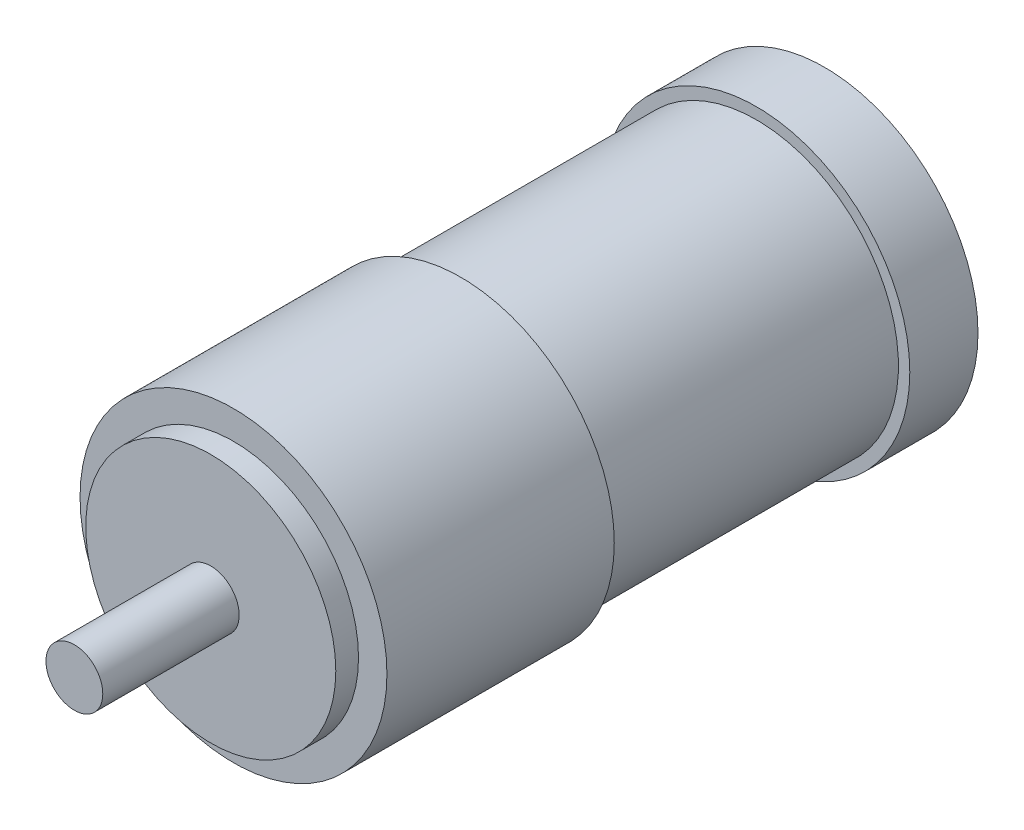
ISO-10303-21;
HEADER;
FILE_DESCRIPTION(('STEP AP214'),'2;1');
FILE_NAME('part.step','',(''),(''),'','','');
FILE_SCHEMA(('AUTOMOTIVE_DESIGN { 1 0 10303 214 1 1 1 1 }'));
ENDSEC;
DATA;
#1=APPLICATION_CONTEXT('core data for automotive mechanical design processes');
#2=APPLICATION_PROTOCOL_DEFINITION('international standard','automotive_design',2000,#1);
#3=PRODUCT_CONTEXT('',#1,'mechanical');
#4=PRODUCT('Part','Part','',(#3));
#5=PRODUCT_RELATED_PRODUCT_CATEGORY('part','',(#4));
#6=PRODUCT_DEFINITION_FORMATION('','',#4);
#7=PRODUCT_DEFINITION_CONTEXT('part definition',#1,'design');
#8=PRODUCT_DEFINITION('design','',#6,#7);
#9=PRODUCT_DEFINITION_SHAPE('','',#8);
#10=(LENGTH_UNIT() NAMED_UNIT(*) SI_UNIT(.MILLI.,.METRE.));
#11=(NAMED_UNIT(*) PLANE_ANGLE_UNIT() SI_UNIT($,.RADIAN.));
#12=(NAMED_UNIT(*) SI_UNIT($,.STERADIAN.) SOLID_ANGLE_UNIT());
#13=UNCERTAINTY_MEASURE_WITH_UNIT(LENGTH_MEASURE(1.E-05),#10,'distance_accuracy_value','');
#14=(GEOMETRIC_REPRESENTATION_CONTEXT(3) GLOBAL_UNCERTAINTY_ASSIGNED_CONTEXT((#13)) GLOBAL_UNIT_ASSIGNED_CONTEXT((#10,
#11,#12)) REPRESENTATION_CONTEXT('',''));
#15=CARTESIAN_POINT('',(0.,0.,0.));
#16=DIRECTION('',(0.,0.,1.));
#17=DIRECTION('',(1.,0.,0.));
#18=AXIS2_PLACEMENT_3D('',#15,#16,#17);
#19=CARTESIAN_POINT('',(0.,0.,52.));
#20=DIRECTION('',(0.,0.,-1.));
#21=DIRECTION('',(-1.,0.,0.));
#22=AXIS2_PLACEMENT_3D('',#19,#20,#21);
#23=CYLINDRICAL_SURFACE('',#22,12.5);
#24=CARTESIAN_POINT('',(0.,0.,32.));
#25=DIRECTION('',(0.,0.,1.));
#26=DIRECTION('',(1.,0.,0.));
#27=AXIS2_PLACEMENT_3D('',#24,#25,#26);
#28=CIRCLE('',#27,12.5);
#29=CARTESIAN_POINT('',(-12.5,0.,32.));
#30=VERTEX_POINT('',#29);
#31=EDGE_CURVE('E81',#30,#30,#28,.T.);
#32=CARTESIAN_POINT('',(0.,0.,6.));
#33=DIRECTION('',(0.,0.,-1.));
#34=DIRECTION('',(-1.,0.,0.));
#35=AXIS2_PLACEMENT_3D('',#32,#33,#34);
#36=CIRCLE('',#35,12.5);
#37=CARTESIAN_POINT('',(-12.5,0.,6.00000000000001));
#38=VERTEX_POINT('',#37);
#39=EDGE_CURVE('E65',#38,#38,#36,.T.);
#40=CARTESIAN_POINT('',(-12.5,0.,32.));
#41=CARTESIAN_POINT('',(-12.5,0.,31.7291666666667));
#42=CARTESIAN_POINT('',(-12.5,0.,31.4583333333333));
#43=CARTESIAN_POINT('',(-12.5,0.,30.9166666666667));
#44=CARTESIAN_POINT('',(-12.5,0.,30.6458333333333));
#45=CARTESIAN_POINT('',(-12.5,0.,30.1041666666667));
#46=CARTESIAN_POINT('',(-12.5,0.,29.8333333333333));
#47=CARTESIAN_POINT('',(-12.5,0.,29.2916666666667));
#48=CARTESIAN_POINT('',(-12.5,0.,29.0208333333333));
#49=CARTESIAN_POINT('',(-12.5,0.,28.4791666666667));
#50=CARTESIAN_POINT('',(-12.5,0.,28.2083333333333));
#51=CARTESIAN_POINT('',(-12.5,0.,27.6666666666667));
#52=CARTESIAN_POINT('',(-12.5,0.,27.3958333333333));
#53=CARTESIAN_POINT('',(-12.5,0.,26.8541666666667));
#54=CARTESIAN_POINT('',(-12.5,0.,26.5833333333333));
#55=CARTESIAN_POINT('',(-12.5,0.,26.0416666666667));
#56=CARTESIAN_POINT('',(-12.5,0.,25.7708333333333));
#57=CARTESIAN_POINT('',(-12.5,0.,25.2291666666667));
#58=CARTESIAN_POINT('',(-12.5,0.,24.9583333333333));
#59=CARTESIAN_POINT('',(-12.5,0.,24.4166666666667));
#60=CARTESIAN_POINT('',(-12.5,0.,24.1458333333333));
#61=CARTESIAN_POINT('',(-12.5,0.,23.6041666666667));
#62=CARTESIAN_POINT('',(-12.5,0.,23.3333333333333));
#63=CARTESIAN_POINT('',(-12.5,0.,22.7916666666667));
#64=CARTESIAN_POINT('',(-12.5,0.,22.5208333333333));
#65=CARTESIAN_POINT('',(-12.5,0.,21.9791666666667));
#66=CARTESIAN_POINT('',(-12.5,0.,21.7083333333333));
#67=CARTESIAN_POINT('',(-12.5,0.,21.1666666666667));
#68=CARTESIAN_POINT('',(-12.5,0.,20.8958333333333));
#69=CARTESIAN_POINT('',(-12.5,0.,20.3541666666667));
#70=CARTESIAN_POINT('',(-12.5,0.,20.0833333333333));
#71=CARTESIAN_POINT('',(-12.5,0.,19.5416666666667));
#72=CARTESIAN_POINT('',(-12.5,0.,19.2708333333333));
#73=CARTESIAN_POINT('',(-12.5,0.,18.7291666666667));
#74=CARTESIAN_POINT('',(-12.5,0.,18.4583333333333));
#75=CARTESIAN_POINT('',(-12.5,0.,17.9166666666667));
#76=CARTESIAN_POINT('',(-12.5,0.,17.6458333333333));
#77=CARTESIAN_POINT('',(-12.5,0.,17.1041666666667));
#78=CARTESIAN_POINT('',(-12.5,0.,16.8333333333333));
#79=CARTESIAN_POINT('',(-12.5,0.,16.2916666666667));
#80=CARTESIAN_POINT('',(-12.5,0.,16.0208333333333));
#81=CARTESIAN_POINT('',(-12.5,0.,15.4791666666667));
#82=CARTESIAN_POINT('',(-12.5,0.,15.2083333333333));
#83=CARTESIAN_POINT('',(-12.5,0.,14.6666666666667));
#84=CARTESIAN_POINT('',(-12.5,0.,14.3958333333333));
#85=CARTESIAN_POINT('',(-12.5,0.,13.8541666666667));
#86=CARTESIAN_POINT('',(-12.5,0.,13.5833333333333));
#87=CARTESIAN_POINT('',(-12.5,0.,13.0416666666667));
#88=CARTESIAN_POINT('',(-12.5,0.,12.7708333333333));
#89=CARTESIAN_POINT('',(-12.5,0.,12.2291666666667));
#90=CARTESIAN_POINT('',(-12.5,0.,11.9583333333333));
#91=CARTESIAN_POINT('',(-12.5,0.,11.4166666666667));
#92=CARTESIAN_POINT('',(-12.5,0.,11.1458333333333));
#93=CARTESIAN_POINT('',(-12.5,0.,10.6041666666667));
#94=CARTESIAN_POINT('',(-12.5,0.,10.3333333333333));
#95=CARTESIAN_POINT('',(-12.5,0.,9.79166666666667));
#96=CARTESIAN_POINT('',(-12.5,0.,9.52083333333334));
#97=CARTESIAN_POINT('',(-12.5,0.,8.97916666666667));
#98=CARTESIAN_POINT('',(-12.5,0.,8.70833333333334));
#99=CARTESIAN_POINT('',(-12.5,0.,8.16666666666667));
#100=CARTESIAN_POINT('',(-12.5,0.,7.89583333333334));
#101=CARTESIAN_POINT('',(-12.5,0.,7.35416666666667));
#102=CARTESIAN_POINT('',(-12.5,0.,7.08333333333334));
#103=CARTESIAN_POINT('',(-12.5,0.,6.54166666666667));
#104=CARTESIAN_POINT('',(-12.5,0.,6.27083333333334));
#105=CARTESIAN_POINT('',(-12.5,0.,6.00000000000001));
#106=B_SPLINE_CURVE_WITH_KNOTS('',3,(#40,#41,#42,#43,#44,#45,#46,#47,#48,#49,#50,#51,#52,#53,
#54,#55,#56,#57,#58,#59,#60,#61,#62,#63,#64,#65,#66,#67,#68,#69,#70,#71,#72,#73,#74,#75,#76,#77,
#78,#79,#80,#81,#82,#83,#84,#85,#86,#87,#88,#89,#90,#91,#92,#93,#94,#95,#96,#97,#98,#99,#100,
#101,#102,#103,#104,#105),.UNSPECIFIED.,.F.,.F.,(4,2,2,2,2,2,2,2,2,2,2,2,2,2,2,2,2,2,2,2,2,2,2,
2,2,2,2,2,2,2,2,2,4),(0.,0.812500000000004,1.625,2.4375,3.25,4.0625,4.875,5.6875,6.5,7.3125,
8.125,8.9375,9.75,10.5625,11.375,12.1875,13.,13.8125,14.625,15.4375,16.25,17.0625,17.875,
18.6875,19.5,20.3125,21.125,21.9375,22.75,23.5625,24.375,25.1875,26.),.UNSPECIFIED.);
#107=EDGE_CURVE('BSEAM47',#30,#38,#106,.T.);
#108=ORIENTED_EDGE('',*,*,#31,.F.);
#109=ORIENTED_EDGE('',*,*,#39,.F.);
#110=ORIENTED_EDGE('',*,*,#107,.T.);
#111=ORIENTED_EDGE('',*,*,#107,.F.);
#112=EDGE_LOOP('',(#108,#110,#109,#111));
#113=FACE_BOUND('',#112,.T.);
#114=ADVANCED_FACE('F47',(#113),#23,.T.);
#115=CARTESIAN_POINT('',(0.,0.,52.));
#116=DIRECTION('',(0.,0.,1.));
#117=DIRECTION('',(1.,0.,0.));
#118=AXIS2_PLACEMENT_3D('',#115,#116,#117);
#119=PLANE('',#118);
#120=CARTESIAN_POINT('',(0.,0.,52.));
#121=DIRECTION('',(0.,0.,1.));
#122=DIRECTION('',(1.,0.,0.));
#123=AXIS2_PLACEMENT_3D('',#120,#121,#122);
#124=CIRCLE('',#123,11.);
#125=CARTESIAN_POINT('',(11.,0.,52.));
#126=VERTEX_POINT('',#125);
#127=EDGE_CURVE('E77',#126,#126,#124,.T.);
#128=ORIENTED_EDGE('',*,*,#127,.F.);
#129=EDGE_LOOP('',(#128));
#130=FACE_BOUND('',#129,.T.);
#131=CARTESIAN_POINT('',(0.,0.,52.));
#132=DIRECTION('',(0.,0.,1.));
#133=DIRECTION('',(1.,0.,0.));
#134=AXIS2_PLACEMENT_3D('',#131,#132,#133);
#135=CIRCLE('',#134,13.5);
#136=CARTESIAN_POINT('',(13.5,0.,52.));
#137=VERTEX_POINT('',#136);
#138=EDGE_CURVE('E73',#137,#137,#135,.T.);
#139=ORIENTED_EDGE('',*,*,#138,.T.);
#140=EDGE_LOOP('',(#139));
#141=FACE_BOUND('',#140,.T.);
#142=ADVANCED_FACE('F108',(#130,#141),#119,.T.);
#143=CARTESIAN_POINT('',(0.,0.,54.));
#144=DIRECTION('',(0.,0.,-1.));
#145=DIRECTION('',(-1.,0.,0.));
#146=AXIS2_PLACEMENT_3D('',#143,#144,#145);
#147=CYLINDRICAL_SURFACE('',#146,11.);
#148=CARTESIAN_POINT('',(0.,0.,54.));
#149=DIRECTION('',(0.,0.,1.));
#150=DIRECTION('',(1.,0.,0.));
#151=AXIS2_PLACEMENT_3D('',#148,#149,#150);
#152=CIRCLE('',#151,11.);
#153=CARTESIAN_POINT('',(11.,0.,54.));
#154=VERTEX_POINT('',#153);
#155=EDGE_CURVE('E90',#154,#154,#152,.T.);
#156=ORIENTED_EDGE('',*,*,#155,.F.);
#157=EDGE_LOOP('',(#156));
#158=FACE_BOUND('',#157,.T.);
#159=ORIENTED_EDGE('',*,*,#127,.T.);
#160=EDGE_LOOP('',(#159));
#161=FACE_BOUND('',#160,.T.);
#162=ADVANCED_FACE('F114',(#158,#161),#147,.T.);
#163=CARTESIAN_POINT('',(0.,0.,54.));
#164=DIRECTION('',(0.,0.,1.));
#165=DIRECTION('',(1.,0.,0.));
#166=AXIS2_PLACEMENT_3D('',#163,#164,#165);
#167=PLANE('',#166);
#168=CARTESIAN_POINT('',(0.,0.,54.));
#169=DIRECTION('',(0.,0.,1.));
#170=DIRECTION('',(1.,0.,0.));
#171=AXIS2_PLACEMENT_3D('',#168,#169,#170);
#172=CIRCLE('',#171,2.5);
#173=CARTESIAN_POINT('',(2.5,0.,54.));
#174=VERTEX_POINT('',#173);
#175=EDGE_CURVE('E86',#174,#174,#172,.T.);
#176=ORIENTED_EDGE('',*,*,#175,.F.);
#177=EDGE_LOOP('',(#176));
#178=FACE_BOUND('',#177,.T.);
#179=ORIENTED_EDGE('',*,*,#155,.T.);
#180=EDGE_LOOP('',(#179));
#181=FACE_BOUND('',#180,.T.);
#182=ADVANCED_FACE('F126',(#178,#181),#167,.T.);
#183=CARTESIAN_POINT('',(0.,0.,66.));
#184=DIRECTION('',(0.,0.,-1.));
#185=DIRECTION('',(-1.,0.,0.));
#186=AXIS2_PLACEMENT_3D('',#183,#184,#185);
#187=CYLINDRICAL_SURFACE('',#186,2.5);
#188=CARTESIAN_POINT('',(0.,0.,66.));
#189=DIRECTION('',(0.,0.,1.));
#190=DIRECTION('',(1.,0.,0.));
#191=AXIS2_PLACEMENT_3D('',#188,#189,#190);
#192=CIRCLE('',#191,2.5);
#193=CARTESIAN_POINT('',(2.5,0.,66.));
#194=VERTEX_POINT('',#193);
#195=EDGE_CURVE('E82',#194,#194,#192,.T.);
#196=ORIENTED_EDGE('',*,*,#195,.F.);
#197=EDGE_LOOP('',(#196));
#198=FACE_BOUND('',#197,.T.);
#199=ORIENTED_EDGE('',*,*,#175,.T.);
#200=EDGE_LOOP('',(#199));
#201=FACE_BOUND('',#200,.T.);
#202=ADVANCED_FACE('F130',(#198,#201),#187,.T.);
#203=CARTESIAN_POINT('',(0.,0.,66.));
#204=DIRECTION('',(0.,0.,1.));
#205=DIRECTION('',(1.,0.,0.));
#206=AXIS2_PLACEMENT_3D('',#203,#204,#205);
#207=PLANE('',#206);
#208=ORIENTED_EDGE('',*,*,#195,.T.);
#209=EDGE_LOOP('',(#208));
#210=FACE_BOUND('',#209,.T.);
#211=ADVANCED_FACE('F134',(#210),#207,.T.);
#212=CARTESIAN_POINT('',(0.,0.,32.));
#213=DIRECTION('',(0.,0.,1.));
#214=DIRECTION('',(1.,0.,0.));
#215=AXIS2_PLACEMENT_3D('',#212,#213,#214);
#216=PLANE('',#215);
#217=CARTESIAN_POINT('',(0.,0.,32.));
#218=DIRECTION('',(0.,0.,1.));
#219=DIRECTION('',(1.,0.,0.));
#220=AXIS2_PLACEMENT_3D('',#217,#218,#219);
#221=CIRCLE('',#220,13.5);
#222=CARTESIAN_POINT('',(13.5,0.,32.));
#223=VERTEX_POINT('',#222);
#224=EDGE_CURVE('E71',#223,#223,#221,.T.);
#225=ORIENTED_EDGE('',*,*,#224,.F.);
#226=EDGE_LOOP('',(#225));
#227=FACE_BOUND('',#226,.T.);
#228=ORIENTED_EDGE('',*,*,#31,.T.);
#229=EDGE_LOOP('',(#228));
#230=FACE_BOUND('',#229,.T.);
#231=ADVANCED_FACE('F138',(#227,#230),#216,.F.);
#232=CARTESIAN_POINT('',(0.,0.,52.));
#233=DIRECTION('',(0.,0.,-1.));
#234=DIRECTION('',(-1.,0.,0.));
#235=AXIS2_PLACEMENT_3D('',#232,#233,#234);
#236=CYLINDRICAL_SURFACE('',#235,13.5);
#237=ORIENTED_EDGE('',*,*,#138,.F.);
#238=EDGE_LOOP('',(#237));
#239=FACE_BOUND('',#238,.T.);
#240=ORIENTED_EDGE('',*,*,#224,.T.);
#241=EDGE_LOOP('',(#240));
#242=FACE_BOUND('',#241,.T.);
#243=ADVANCED_FACE('F140',(#239,#242),#236,.T.);
#244=CARTESIAN_POINT('',(0.,0.,6.));
#245=DIRECTION('',(0.,0.,-1.));
#246=DIRECTION('',(-1.,0.,0.));
#247=AXIS2_PLACEMENT_3D('',#244,#245,#246);
#248=CYLINDRICAL_SURFACE('',#247,13.5);
#249=CARTESIAN_POINT('',(0.,0.,6.));
#250=DIRECTION('',(0.,0.,-1.));
#251=DIRECTION('',(-1.,0.,0.));
#252=AXIS2_PLACEMENT_3D('',#249,#250,#251);
#253=CIRCLE('',#252,13.5);
#254=CARTESIAN_POINT('',(-13.5,0.,6.));
#255=VERTEX_POINT('',#254);
#256=EDGE_CURVE('E68',#255,#255,#253,.T.);
#257=ORIENTED_EDGE('',*,*,#256,.T.);
#258=EDGE_LOOP('',(#257));
#259=FACE_BOUND('',#258,.T.);
#260=CARTESIAN_POINT('',(0.,0.,0.));
#261=DIRECTION('',(0.,0.,-1.));
#262=DIRECTION('',(-1.,0.,0.));
#263=AXIS2_PLACEMENT_3D('',#260,#261,#262);
#264=CIRCLE('',#263,13.5);
#265=CARTESIAN_POINT('',(-13.5,0.,0.));
#266=VERTEX_POINT('',#265);
#267=EDGE_CURVE('E60',#266,#266,#264,.T.);
#268=ORIENTED_EDGE('',*,*,#267,.F.);
#269=EDGE_LOOP('',(#268));
#270=FACE_BOUND('',#269,.T.);
#271=ADVANCED_FACE('F143',(#259,#270),#248,.T.);
#272=CARTESIAN_POINT('',(0.,0.,6.));
#273=DIRECTION('',(0.,0.,-1.));
#274=DIRECTION('',(-1.,0.,0.));
#275=AXIS2_PLACEMENT_3D('',#272,#273,#274);
#276=PLANE('',#275);
#277=ORIENTED_EDGE('',*,*,#39,.T.);
#278=EDGE_LOOP('',(#277));
#279=FACE_BOUND('',#278,.T.);
#280=ORIENTED_EDGE('',*,*,#256,.F.);
#281=EDGE_LOOP('',(#280));
#282=FACE_BOUND('',#281,.T.);
#283=ADVANCED_FACE('F104',(#279,#282),#276,.F.);
#284=CARTESIAN_POINT('',(0.,0.,0.));
#285=DIRECTION('',(0.,0.,1.));
#286=DIRECTION('',(1.,0.,0.));
#287=AXIS2_PLACEMENT_3D('',#284,#285,#286);
#288=PLANE('',#287);
#289=CARTESIAN_POINT('',(0.,0.,0.));
#290=DIRECTION('',(0.,0.,-1.));
#291=DIRECTION('',(-1.,0.,0.));
#292=AXIS2_PLACEMENT_3D('',#289,#290,#291);
#293=CIRCLE('',#292,12.5);
#294=CARTESIAN_POINT('',(-12.5,0.,0.));
#295=VERTEX_POINT('',#294);
#296=EDGE_CURVE('E55',#295,#295,#293,.T.);
#297=ORIENTED_EDGE('',*,*,#296,.F.);
#298=EDGE_LOOP('',(#297));
#299=FACE_BOUND('',#298,.T.);
#300=ORIENTED_EDGE('',*,*,#267,.T.);
#301=EDGE_LOOP('',(#300));
#302=FACE_BOUND('',#301,.T.);
#303=ADVANCED_FACE('F119',(#299,#302),#288,.F.);
#304=CARTESIAN_POINT('',(0.,0.,2.));
#305=DIRECTION('',(0.,0.,-1.));
#306=DIRECTION('',(-1.,0.,0.));
#307=AXIS2_PLACEMENT_3D('',#304,#305,#306);
#308=CYLINDRICAL_SURFACE('',#307,12.5);
#309=CARTESIAN_POINT('',(0.,0.,2.));
#310=DIRECTION('',(0.,0.,-1.));
#311=DIRECTION('',(-1.,0.,0.));
#312=AXIS2_PLACEMENT_3D('',#309,#310,#311);
#313=CIRCLE('',#312,12.5);
#314=CARTESIAN_POINT('',(-12.5,0.,2.));
#315=VERTEX_POINT('',#314);
#316=EDGE_CURVE('E11',#315,#315,#313,.T.);
#317=ORIENTED_EDGE('',*,*,#316,.F.);
#318=EDGE_LOOP('',(#317));
#319=FACE_BOUND('',#318,.T.);
#320=ORIENTED_EDGE('',*,*,#296,.T.);
#321=EDGE_LOOP('',(#320));
#322=FACE_BOUND('',#321,.T.);
#323=ADVANCED_FACE('F121',(#319,#322),#308,.F.);
#324=CARTESIAN_POINT('',(0.,0.,2.));
#325=DIRECTION('',(0.,0.,-1.));
#326=DIRECTION('',(-1.,0.,0.));
#327=AXIS2_PLACEMENT_3D('',#324,#325,#326);
#328=PLANE('',#327);
#329=ORIENTED_EDGE('',*,*,#316,.T.);
#330=EDGE_LOOP('',(#329));
#331=FACE_BOUND('',#330,.T.);
#332=ADVANCED_FACE('F49',(#331),#328,.T.);
#333=CLOSED_SHELL('',(#114,#142,#162,#182,#202,#211,#231,#243,#271,#283,#303,#323,#332));
#334=MANIFOLD_SOLID_BREP('B2',#333);
#335=CARTESIAN_POINT('',(0.,0.,-2.));
#336=DIRECTION('',(0.,0.,-1.));
#337=DIRECTION('',(-1.,0.,0.));
#338=AXIS2_PLACEMENT_3D('',#335,#336,#337);
#339=PLANE('',#338);
#340=CARTESIAN_POINT('',(0.,0.,-2.));
#341=DIRECTION('',(0.,0.,-1.));
#342=DIRECTION('',(-1.,0.,0.));
#343=AXIS2_PLACEMENT_3D('',#340,#341,#342);
#344=CIRCLE('',#343,9.);
#345=CARTESIAN_POINT('',(-9.,0.,-2.));
#346=VERTEX_POINT('',#345);
#347=EDGE_CURVE('E46',#346,#346,#344,.T.);
#348=ORIENTED_EDGE('',*,*,#347,.T.);
#349=EDGE_LOOP('',(#348));
#350=FACE_BOUND('',#349,.T.);
#351=ADVANCED_FACE('F262',(#350),#339,.T.);
#352=CARTESIAN_POINT('',(0.,0.,-2.));
#353=DIRECTION('',(0.,0.,1.));
#354=DIRECTION('',(1.,0.,0.));
#355=AXIS2_PLACEMENT_3D('',#352,#353,#354);
#356=CYLINDRICAL_SURFACE('',#355,9.);
#357=ORIENTED_EDGE('',*,*,#347,.F.);
#358=EDGE_LOOP('',(#357));
#359=FACE_BOUND('',#358,.T.);
#360=CARTESIAN_POINT('',(0.,0.,0.));
#361=DIRECTION('',(0.,0.,-1.));
#362=DIRECTION('',(-1.,0.,0.));
#363=AXIS2_PLACEMENT_3D('',#360,#361,#362);
#364=CIRCLE('',#363,9.);
#365=CARTESIAN_POINT('',(-9.,0.,0.));
#366=VERTEX_POINT('',#365);
#367=EDGE_CURVE('E269',#366,#366,#364,.T.);
#368=ORIENTED_EDGE('',*,*,#367,.T.);
#369=EDGE_LOOP('',(#368));
#370=FACE_BOUND('',#369,.T.);
#371=ADVANCED_FACE('F264',(#359,#370),#356,.T.);
#372=CARTESIAN_POINT('',(0.,0.,0.));
#373=DIRECTION('',(0.,0.,-1.));
#374=DIRECTION('',(-1.,0.,0.));
#375=AXIS2_PLACEMENT_3D('',#372,#373,#374);
#376=PLANE('',#375);
#377=ORIENTED_EDGE('',*,*,#367,.F.);
#378=EDGE_LOOP('',(#377));
#379=FACE_BOUND('',#378,.T.);
#380=ADVANCED_FACE('F276',(#379),#376,.F.);
#381=CLOSED_SHELL('',(#351,#371,#380));
#382=MANIFOLD_SOLID_BREP('B6',#381);
#383=ADVANCED_BREP_SHAPE_REPRESENTATION('',(#18,#334,#382),#14);
#384=SHAPE_DEFINITION_REPRESENTATION(#9,#383);
ENDSEC;
END-ISO-10303-21;
